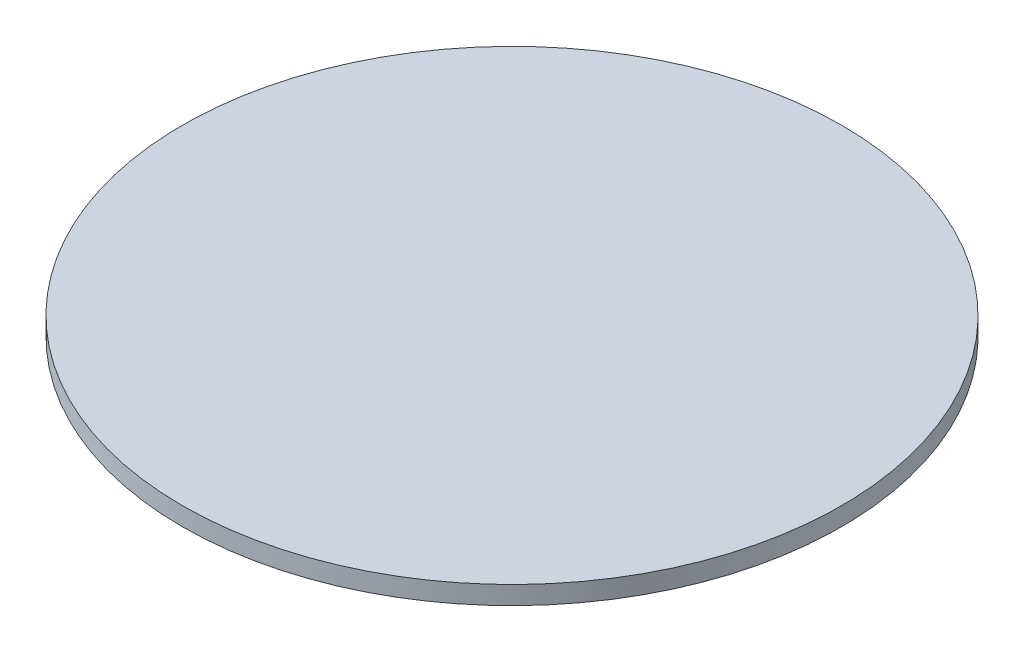
ISO-10303-21;
HEADER;
FILE_DESCRIPTION(('STEP AP214'),'2;1');
FILE_NAME('part.step','',(''),(''),'','','');
FILE_SCHEMA(('AUTOMOTIVE_DESIGN { 1 0 10303 214 1 1 1 1 }'));
ENDSEC;
DATA;
#1=APPLICATION_CONTEXT('core data for automotive mechanical design processes');
#2=APPLICATION_PROTOCOL_DEFINITION('international standard','automotive_design',2000,#1);
#3=PRODUCT_CONTEXT('',#1,'mechanical');
#4=PRODUCT('Part','Part','',(#3));
#5=PRODUCT_RELATED_PRODUCT_CATEGORY('part','',(#4));
#6=PRODUCT_DEFINITION_FORMATION('','',#4);
#7=PRODUCT_DEFINITION_CONTEXT('part definition',#1,'design');
#8=PRODUCT_DEFINITION('design','',#6,#7);
#9=PRODUCT_DEFINITION_SHAPE('','',#8);
#10=(LENGTH_UNIT() NAMED_UNIT(*) SI_UNIT(.MILLI.,.METRE.));
#11=(NAMED_UNIT(*) PLANE_ANGLE_UNIT() SI_UNIT($,.RADIAN.));
#12=(NAMED_UNIT(*) SI_UNIT($,.STERADIAN.) SOLID_ANGLE_UNIT());
#13=UNCERTAINTY_MEASURE_WITH_UNIT(LENGTH_MEASURE(1.E-05),#10,'distance_accuracy_value','');
#14=(GEOMETRIC_REPRESENTATION_CONTEXT(3) GLOBAL_UNCERTAINTY_ASSIGNED_CONTEXT((#13)) GLOBAL_UNIT_ASSIGNED_CONTEXT((#10,
#11,#12)) REPRESENTATION_CONTEXT('',''));
#15=CARTESIAN_POINT('',(0.,0.,0.));
#16=DIRECTION('',(0.,0.,1.));
#17=DIRECTION('',(1.,0.,0.));
#18=AXIS2_PLACEMENT_3D('',#15,#16,#17);
#19=CARTESIAN_POINT('',(0.,1.5,0.));
#20=DIRECTION('',(0.,-1.,0.));
#21=DIRECTION('',(0.,0.,-1.));
#22=AXIS2_PLACEMENT_3D('',#19,#20,#21);
#23=CYLINDRICAL_SURFACE('',#22,27.);
#24=CARTESIAN_POINT('',(0.,1.5,0.));
#25=DIRECTION('',(0.,1.,0.));
#26=DIRECTION('',(0.,0.,1.));
#27=AXIS2_PLACEMENT_3D('',#24,#25,#26);
#28=CIRCLE('',#27,27.);
#29=CARTESIAN_POINT('',(0.,1.5,27.));
#30=VERTEX_POINT('',#29);
#31=EDGE_CURVE('E10',#30,#30,#28,.T.);
#32=ORIENTED_EDGE('',*,*,#31,.F.);
#33=EDGE_LOOP('',(#32));
#34=FACE_BOUND('',#33,.T.);
#35=CARTESIAN_POINT('',(0.,0.,0.));
#36=DIRECTION('',(0.,1.,0.));
#37=DIRECTION('',(0.,0.,1.));
#38=AXIS2_PLACEMENT_3D('',#35,#36,#37);
#39=CIRCLE('',#38,27.);
#40=CARTESIAN_POINT('',(0.,0.,27.));
#41=VERTEX_POINT('',#40);
#42=EDGE_CURVE('E38',#41,#41,#39,.T.);
#43=ORIENTED_EDGE('',*,*,#42,.T.);
#44=EDGE_LOOP('',(#43));
#45=FACE_BOUND('',#44,.T.);
#46=ADVANCED_FACE('F35',(#34,#45),#23,.T.);
#47=CARTESIAN_POINT('',(0.,1.5,0.));
#48=DIRECTION('',(0.,1.,0.));
#49=DIRECTION('',(0.,0.,1.));
#50=AXIS2_PLACEMENT_3D('',#47,#48,#49);
#51=PLANE('',#50);
#52=ORIENTED_EDGE('',*,*,#31,.T.);
#53=EDGE_LOOP('',(#52));
#54=FACE_BOUND('',#53,.T.);
#55=ADVANCED_FACE('F50',(#54),#51,.T.);
#56=CARTESIAN_POINT('',(0.,0.,0.));
#57=DIRECTION('',(0.,1.,0.));
#58=DIRECTION('',(0.,0.,1.));
#59=AXIS2_PLACEMENT_3D('',#56,#57,#58);
#60=PLANE('',#59);
#61=ORIENTED_EDGE('',*,*,#42,.F.);
#62=EDGE_LOOP('',(#61));
#63=FACE_BOUND('',#62,.T.);
#64=ADVANCED_FACE('F48',(#63),#60,.F.);
#65=CLOSED_SHELL('',(#46,#55,#64));
#66=MANIFOLD_SOLID_BREP('B2',#65);
#67=ADVANCED_BREP_SHAPE_REPRESENTATION('',(#18,#66),#14);
#68=SHAPE_DEFINITION_REPRESENTATION(#9,#67);
ENDSEC;
END-ISO-10303-21;
